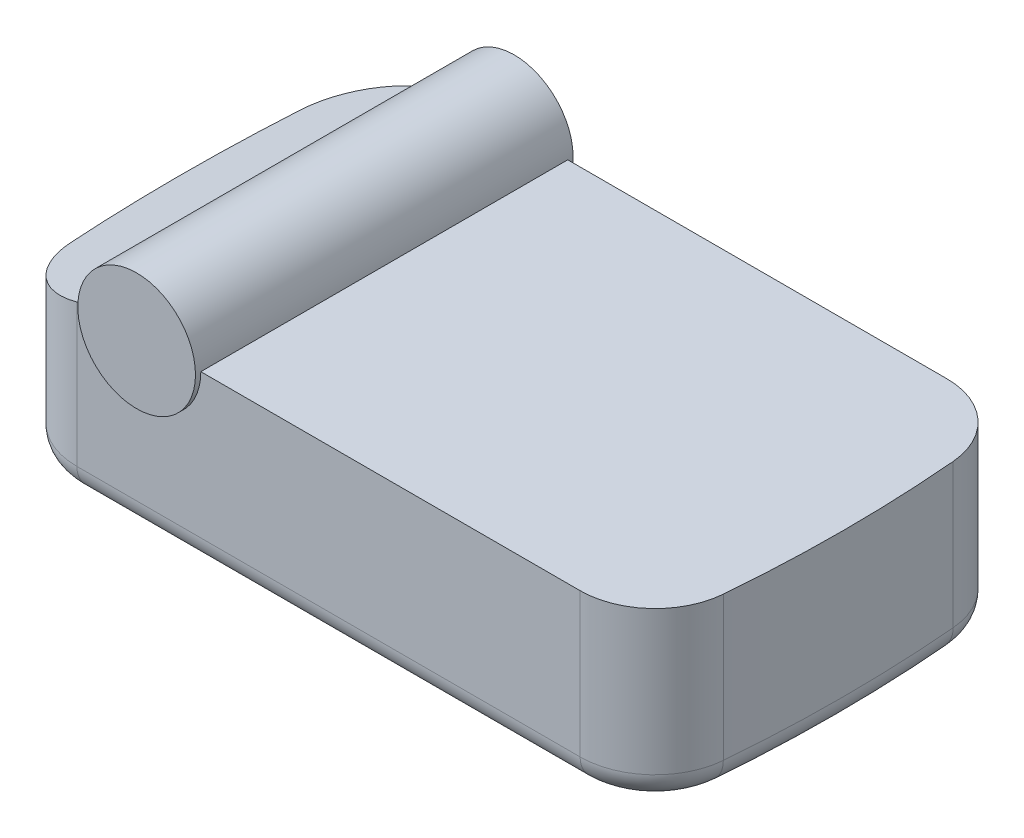
ISO-10303-21;
HEADER;
FILE_DESCRIPTION(('STEP AP214'),'2;1');
FILE_NAME('part.step','',(''),(''),'','','');
FILE_SCHEMA(('AUTOMOTIVE_DESIGN { 1 0 10303 214 1 1 1 1 }'));
ENDSEC;
DATA;
#1=APPLICATION_CONTEXT('core data for automotive mechanical design processes');
#2=APPLICATION_PROTOCOL_DEFINITION('international standard','automotive_design',2000,#1);
#3=PRODUCT_CONTEXT('',#1,'mechanical');
#4=PRODUCT('Part','Part','',(#3));
#5=PRODUCT_RELATED_PRODUCT_CATEGORY('part','',(#4));
#6=PRODUCT_DEFINITION_FORMATION('','',#4);
#7=PRODUCT_DEFINITION_CONTEXT('part definition',#1,'design');
#8=PRODUCT_DEFINITION('design','',#6,#7);
#9=PRODUCT_DEFINITION_SHAPE('','',#8);
#10=(LENGTH_UNIT() NAMED_UNIT(*) SI_UNIT(.MILLI.,.METRE.));
#11=(NAMED_UNIT(*) PLANE_ANGLE_UNIT() SI_UNIT($,.RADIAN.));
#12=(NAMED_UNIT(*) SI_UNIT($,.STERADIAN.) SOLID_ANGLE_UNIT());
#13=UNCERTAINTY_MEASURE_WITH_UNIT(LENGTH_MEASURE(1.E-05),#10,'distance_accuracy_value','');
#14=(GEOMETRIC_REPRESENTATION_CONTEXT(3) GLOBAL_UNCERTAINTY_ASSIGNED_CONTEXT((#13)) GLOBAL_UNIT_ASSIGNED_CONTEXT((#10,
#11,#12)) REPRESENTATION_CONTEXT('',''));
#15=CARTESIAN_POINT('',(0.,0.,0.));
#16=DIRECTION('',(0.,0.,1.));
#17=DIRECTION('',(1.,0.,0.));
#18=AXIS2_PLACEMENT_3D('',#15,#16,#17);
#19=CARTESIAN_POINT('',(23.5199690557792,16.,-10.15));
#20=DIRECTION('',(0.,-1.,0.));
#21=DIRECTION('',(0.,0.,-1.));
#22=AXIS2_PLACEMENT_3D('',#19,#20,#21);
#23=PLANE('',#22);
#24=DIRECTION('',(-1.,0.,0.));
#25=VECTOR('',#24,1.);
#26=CARTESIAN_POINT('',(-23.5199690557792,16.,-17.15));
#27=LINE('',#26,#25);
#28=CARTESIAN_POINT('',(23.5199690557792,16.,-17.15));
#29=VERTEX_POINT('',#28);
#30=CARTESIAN_POINT('',(-11.9389939517277,16.,-17.15));
#31=VERTEX_POINT('',#30);
#32=EDGE_CURVE('E301',#29,#31,#27,.T.);
#33=ORIENTED_EDGE('',*,*,#32,.T.);
#34=DIRECTION('',(0.,0.,1.));
#35=VECTOR('',#34,1.);
#36=CARTESIAN_POINT('',(-11.9389939517277,16.,-33.706349186104));
#37=LINE('',#36,#35);
#38=CARTESIAN_POINT('',(-11.9389939517277,16.,17.15));
#39=VERTEX_POINT('',#38);
#40=EDGE_CURVE('E13',#31,#39,#37,.T.);
#41=ORIENTED_EDGE('',*,*,#40,.T.);
#42=DIRECTION('',(1.,0.,0.));
#43=VECTOR('',#42,1.);
#44=CARTESIAN_POINT('',(-23.5199690557792,16.,17.15));
#45=LINE('',#44,#43);
#46=CARTESIAN_POINT('',(23.5199690557792,16.,17.15));
#47=VERTEX_POINT('',#46);
#48=EDGE_CURVE('E304',#39,#47,#45,.T.);
#49=ORIENTED_EDGE('',*,*,#48,.T.);
#50=CARTESIAN_POINT('',(23.5199690557792,16.,10.15));
#51=DIRECTION('',(0.,1.,0.));
#52=DIRECTION('',(0.,0.,1.));
#53=AXIS2_PLACEMENT_3D('',#50,#51,#52);
#54=CIRCLE('',#53,6.99999999999999);
#55=CARTESIAN_POINT('',(30.4948839173664,16.,10.7420833333333));
#56=VERTEX_POINT('',#55);
#57=EDGE_CURVE('E307',#47,#56,#54,.T.);
#58=ORIENTED_EDGE('',*,*,#57,.T.);
#59=CARTESIAN_POINT('',(-96.05,16.,0.));
#60=DIRECTION('',(0.,1.,0.));
#61=DIRECTION('',(0.,0.,-1.));
#62=AXIS2_PLACEMENT_3D('',#59,#60,#61);
#63=CIRCLE('',#62,127.);
#64=CARTESIAN_POINT('',(30.4948839173663,16.,-10.7420833333333));
#65=VERTEX_POINT('',#64);
#66=EDGE_CURVE('E310',#56,#65,#63,.T.);
#67=ORIENTED_EDGE('',*,*,#66,.T.);
#68=CARTESIAN_POINT('',(23.5199690557792,16.,-10.15));
#69=DIRECTION('',(0.,1.,0.));
#70=DIRECTION('',(0.,0.,-1.));
#71=AXIS2_PLACEMENT_3D('',#68,#69,#70);
#72=CIRCLE('',#71,6.99999999999999);
#73=EDGE_CURVE('E273',#65,#29,#72,.T.);
#74=ORIENTED_EDGE('',*,*,#73,.T.);
#75=EDGE_LOOP('',(#33,#41,#49,#58,#67,#74));
#76=FACE_BOUND('',#75,.T.);
#77=ADVANCED_FACE('F51',(#76),#23,.F.);
#78=CARTESIAN_POINT('',(23.5199690557792,16.,-10.15));
#79=DIRECTION('',(0.,-1.,0.));
#80=DIRECTION('',(0.,0.,-1.));
#81=AXIS2_PLACEMENT_3D('',#78,#79,#80);
#82=CYLINDRICAL_SURFACE('',#81,6.99999999999999);
#83=DIRECTION('',(0.,-1.,0.));
#84=VECTOR('',#83,1.);
#85=CARTESIAN_POINT('',(30.4948839173663,16.,-10.7420833333333));
#86=LINE('',#85,#84);
#87=CARTESIAN_POINT('',(30.4948839173663,2.54,-10.7420833333333));
#88=VERTEX_POINT('',#87);
#89=EDGE_CURVE('E313',#65,#88,#86,.T.);
#90=ORIENTED_EDGE('',*,*,#89,.T.);
#91=CARTESIAN_POINT('',(23.5199690557792,2.54,-10.15));
#92=DIRECTION('',(0.,-1.,0.));
#93=DIRECTION('',(0.,0.,-1.));
#94=AXIS2_PLACEMENT_3D('',#91,#92,#93);
#95=CIRCLE('',#94,6.99999999999999);
#96=CARTESIAN_POINT('',(23.5199690557792,2.54,-17.15));
#97=VERTEX_POINT('',#96);
#98=EDGE_CURVE('E225',#88,#97,#95,.F.);
#99=ORIENTED_EDGE('',*,*,#98,.T.);
#100=DIRECTION('',(0.,-1.,0.));
#101=VECTOR('',#100,1.);
#102=CARTESIAN_POINT('',(23.5199690557792,16.,-17.15));
#103=LINE('',#102,#101);
#104=EDGE_CURVE('E188',#29,#97,#103,.T.);
#105=ORIENTED_EDGE('',*,*,#104,.F.);
#106=ORIENTED_EDGE('',*,*,#73,.F.);
#107=EDGE_LOOP('',(#90,#99,#105,#106));
#108=FACE_BOUND('',#107,.T.);
#109=ADVANCED_FACE('F343',(#108),#82,.T.);
#110=CARTESIAN_POINT('',(-23.5199690557792,16.,-17.15));
#111=DIRECTION('',(0.,0.,1.));
#112=DIRECTION('',(1.,0.,0.));
#113=AXIS2_PLACEMENT_3D('',#110,#111,#112);
#114=PLANE('',#113);
#115=DIRECTION('',(0.,-1.,0.));
#116=VECTOR('',#115,1.);
#117=CARTESIAN_POINT('',(-23.5199690557792,16.,-17.15));
#118=LINE('',#117,#116);
#119=CARTESIAN_POINT('',(-23.5199690557792,15.8443281900468,-17.15));
#120=VERTEX_POINT('',#119);
#121=CARTESIAN_POINT('',(-23.5199690557792,2.54,-17.15));
#122=VERTEX_POINT('',#121);
#123=EDGE_CURVE('E185',#120,#122,#118,.T.);
#124=ORIENTED_EDGE('',*,*,#123,.F.);
#125=DIRECTION('',(0.96592582628907,0.258819045102515,0.));
#126=VECTOR('',#125,1.);
#127=CARTESIAN_POINT('',(-23.4810511032909,15.8547562239871,-17.15));
#128=LINE('',#127,#126);
#129=CARTESIAN_POINT('',(-22.9389939517277,16.,-17.15));
#130=VERTEX_POINT('',#129);
#131=EDGE_CURVE('E276',#120,#130,#128,.T.);
#132=ORIENTED_EDGE('',*,*,#131,.T.);
#133=CARTESIAN_POINT('',(-17.4389939517277,16.,-17.15));
#134=DIRECTION('',(0.,0.,1.));
#135=DIRECTION('',(1.,0.,0.));
#136=AXIS2_PLACEMENT_3D('',#133,#134,#135);
#137=CIRCLE('',#136,5.5);
#138=EDGE_CURVE('E247',#130,#31,#137,.T.);
#139=ORIENTED_EDGE('',*,*,#138,.T.);
#140=ORIENTED_EDGE('',*,*,#32,.F.);
#141=ORIENTED_EDGE('',*,*,#104,.T.);
#142=DIRECTION('',(-1.,0.,0.));
#143=VECTOR('',#142,1.);
#144=CARTESIAN_POINT('',(-23.5199690557792,2.54,-17.15));
#145=LINE('',#144,#143);
#146=EDGE_CURVE('E221',#97,#122,#145,.T.);
#147=ORIENTED_EDGE('',*,*,#146,.T.);
#148=EDGE_LOOP('',(#124,#132,#139,#140,#141,#147));
#149=FACE_BOUND('',#148,.T.);
#150=ADVANCED_FACE('F283',(#149),#114,.F.);
#151=CARTESIAN_POINT('',(-23.5199690557792,16.,-10.15));
#152=DIRECTION('',(0.,-1.,0.));
#153=DIRECTION('',(0.,0.,-1.));
#154=AXIS2_PLACEMENT_3D('',#151,#152,#153);
#155=CYLINDRICAL_SURFACE('',#154,6.99999999999999);
#156=DIRECTION('',(0.,-1.,0.));
#157=VECTOR('',#156,1.);
#158=CARTESIAN_POINT('',(-30.4948839173663,16.,-10.7420833333333));
#159=LINE('',#158,#157);
#160=CARTESIAN_POINT('',(-30.4948839173663,13.9754053856088,-10.7420833333333));
#161=VERTEX_POINT('',#160);
#162=CARTESIAN_POINT('',(-30.4948839173663,2.54,-10.7420833333333));
#163=VERTEX_POINT('',#162);
#164=EDGE_CURVE('E176',#161,#163,#159,.T.);
#165=ORIENTED_EDGE('',*,*,#164,.F.);
#166=CARTESIAN_POINT('',(-23.5199690557792,15.8443281900468,-10.15));
#167=DIRECTION('',(0.258819045102515,-0.96592582628907,0.));
#168=DIRECTION('',(-0.96592582628907,-0.258819045102515,0.));
#169=AXIS2_PLACEMENT_3D('',#166,#167,#168);
#170=ELLIPSE('',#169,7.24693326287056,6.99999999999999);
#171=EDGE_CURVE('E287',#161,#120,#170,.T.);
#172=ORIENTED_EDGE('',*,*,#171,.T.);
#173=ORIENTED_EDGE('',*,*,#123,.T.);
#174=CARTESIAN_POINT('',(-23.5199690557792,2.54,-10.15));
#175=DIRECTION('',(0.,-1.,0.));
#176=DIRECTION('',(0.,0.,-1.));
#177=AXIS2_PLACEMENT_3D('',#174,#175,#176);
#178=CIRCLE('',#177,6.99999999999999);
#179=EDGE_CURVE('E192',#122,#163,#178,.F.);
#180=ORIENTED_EDGE('',*,*,#179,.T.);
#181=EDGE_LOOP('',(#165,#172,#173,#180));
#182=FACE_BOUND('',#181,.T.);
#183=ADVANCED_FACE('F371',(#182),#155,.T.);
#184=CARTESIAN_POINT('',(96.05,16.,0.));
#185=DIRECTION('',(0.,-1.,0.));
#186=DIRECTION('',(0.,0.,-1.));
#187=AXIS2_PLACEMENT_3D('',#184,#185,#186);
#188=CYLINDRICAL_SURFACE('',#187,127.);
#189=CARTESIAN_POINT('',(96.05,47.8830048375564,0.));
#190=DIRECTION('',(0.258819045102515,-0.96592582628907,0.));
#191=DIRECTION('',(-0.96592582628907,-0.258819045102515,0.));
#192=AXIS2_PLACEMENT_3D('',#189,#190,#191);
#193=ELLIPSE('',#192,131.48007491208,127.);
#194=CARTESIAN_POINT('',(-30.4948839173663,13.9754053856088,10.7420833333333));
#195=VERTEX_POINT('',#194);
#196=EDGE_CURVE('E158',#195,#161,#193,.T.);
#197=ORIENTED_EDGE('',*,*,#196,.T.);
#198=ORIENTED_EDGE('',*,*,#164,.T.);
#199=CARTESIAN_POINT('',(96.05,2.54,0.));
#200=DIRECTION('',(0.,-1.,0.));
#201=DIRECTION('',(0.,0.,-1.));
#202=AXIS2_PLACEMENT_3D('',#199,#200,#201);
#203=CIRCLE('',#202,127.);
#204=CARTESIAN_POINT('',(-30.4948839173663,2.54,10.7420833333333));
#205=VERTEX_POINT('',#204);
#206=EDGE_CURVE('E239',#163,#205,#203,.F.);
#207=ORIENTED_EDGE('',*,*,#206,.T.);
#208=DIRECTION('',(0.,-1.,0.));
#209=VECTOR('',#208,1.);
#210=CARTESIAN_POINT('',(-30.4948839173663,16.,10.7420833333333));
#211=LINE('',#210,#209);
#212=EDGE_CURVE('E67',#195,#205,#211,.T.);
#213=ORIENTED_EDGE('',*,*,#212,.F.);
#214=EDGE_LOOP('',(#197,#198,#207,#213));
#215=FACE_BOUND('',#214,.T.);
#216=ADVANCED_FACE('F413',(#215),#188,.T.);
#217=CARTESIAN_POINT('',(-23.5199690557792,16.,10.15));
#218=DIRECTION('',(0.,-1.,0.));
#219=DIRECTION('',(0.,0.,-1.));
#220=AXIS2_PLACEMENT_3D('',#217,#218,#219);
#221=CYLINDRICAL_SURFACE('',#220,7.);
#222=DIRECTION('',(0.,-1.,0.));
#223=VECTOR('',#222,1.);
#224=CARTESIAN_POINT('',(-23.5199690557792,16.,17.15));
#225=LINE('',#224,#223);
#226=CARTESIAN_POINT('',(-23.5199690557792,15.8443281900468,17.15));
#227=VERTEX_POINT('',#226);
#228=CARTESIAN_POINT('',(-23.5199690557792,2.54,17.15));
#229=VERTEX_POINT('',#228);
#230=EDGE_CURVE('E75',#227,#229,#225,.T.);
#231=ORIENTED_EDGE('',*,*,#230,.F.);
#232=CARTESIAN_POINT('',(-23.5199690557792,15.8443281900468,10.15));
#233=DIRECTION('',(0.258819045102515,-0.96592582628907,0.));
#234=DIRECTION('',(-0.96592582628907,-0.258819045102515,0.));
#235=AXIS2_PLACEMENT_3D('',#232,#233,#234);
#236=ELLIPSE('',#235,7.24693326287057,7.);
#237=EDGE_CURVE('E153',#227,#195,#236,.T.);
#238=ORIENTED_EDGE('',*,*,#237,.T.);
#239=ORIENTED_EDGE('',*,*,#212,.T.);
#240=CARTESIAN_POINT('',(-23.5199690557792,2.54,10.15));
#241=DIRECTION('',(0.,-1.,0.));
#242=DIRECTION('',(0.,0.,-1.));
#243=AXIS2_PLACEMENT_3D('',#240,#241,#242);
#244=CIRCLE('',#243,7.);
#245=EDGE_CURVE('E169',#205,#229,#244,.F.);
#246=ORIENTED_EDGE('',*,*,#245,.T.);
#247=EDGE_LOOP('',(#231,#238,#239,#246));
#248=FACE_BOUND('',#247,.T.);
#249=ADVANCED_FACE('F167',(#248),#221,.T.);
#250=CARTESIAN_POINT('',(-23.5199690557792,16.,17.15));
#251=DIRECTION('',(0.,0.,-1.));
#252=DIRECTION('',(-1.,0.,0.));
#253=AXIS2_PLACEMENT_3D('',#250,#251,#252);
#254=PLANE('',#253);
#255=CARTESIAN_POINT('',(-17.4389939517277,16.,17.15));
#256=DIRECTION('',(0.,0.,-1.));
#257=DIRECTION('',(-1.,0.,0.));
#258=AXIS2_PLACEMENT_3D('',#255,#256,#257);
#259=CIRCLE('',#258,5.5);
#260=CARTESIAN_POINT('',(-22.9389939517277,16.,17.15));
#261=VERTEX_POINT('',#260);
#262=EDGE_CURVE('E164',#39,#261,#259,.T.);
#263=ORIENTED_EDGE('',*,*,#262,.T.);
#264=DIRECTION('',(0.96592582628907,0.258819045102515,0.));
#265=VECTOR('',#264,1.);
#266=CARTESIAN_POINT('',(-22.9389939517277,16.,17.15));
#267=LINE('',#266,#265);
#268=EDGE_CURVE('E156',#227,#261,#267,.T.);
#269=ORIENTED_EDGE('',*,*,#268,.F.);
#270=ORIENTED_EDGE('',*,*,#230,.T.);
#271=DIRECTION('',(1.,0.,0.));
#272=VECTOR('',#271,1.);
#273=CARTESIAN_POINT('',(23.5199690557792,2.54,17.15));
#274=LINE('',#273,#272);
#275=CARTESIAN_POINT('',(23.5199690557792,2.54,17.15));
#276=VERTEX_POINT('',#275);
#277=EDGE_CURVE('E231',#229,#276,#274,.T.);
#278=ORIENTED_EDGE('',*,*,#277,.T.);
#279=DIRECTION('',(0.,-1.,0.));
#280=VECTOR('',#279,1.);
#281=CARTESIAN_POINT('',(23.5199690557792,16.,17.15));
#282=LINE('',#281,#280);
#283=EDGE_CURVE('E172',#47,#276,#282,.T.);
#284=ORIENTED_EDGE('',*,*,#283,.F.);
#285=ORIENTED_EDGE('',*,*,#48,.F.);
#286=EDGE_LOOP('',(#263,#269,#270,#278,#284,#285));
#287=FACE_BOUND('',#286,.T.);
#288=ADVANCED_FACE('F162',(#287),#254,.F.);
#289=CARTESIAN_POINT('',(23.5199690557792,16.,10.15));
#290=DIRECTION('',(0.,-1.,0.));
#291=DIRECTION('',(0.,0.,-1.));
#292=AXIS2_PLACEMENT_3D('',#289,#290,#291);
#293=CYLINDRICAL_SURFACE('',#292,6.99999999999999);
#294=ORIENTED_EDGE('',*,*,#283,.T.);
#295=CARTESIAN_POINT('',(23.5199690557792,2.54,10.15));
#296=DIRECTION('',(0.,-1.,0.));
#297=DIRECTION('',(0.,0.,-1.));
#298=AXIS2_PLACEMENT_3D('',#295,#296,#297);
#299=CIRCLE('',#298,6.99999999999999);
#300=CARTESIAN_POINT('',(30.4948839173664,2.54,10.7420833333333));
#301=VERTEX_POINT('',#300);
#302=EDGE_CURVE('E228',#276,#301,#299,.F.);
#303=ORIENTED_EDGE('',*,*,#302,.T.);
#304=DIRECTION('',(0.,-1.,0.));
#305=VECTOR('',#304,1.);
#306=CARTESIAN_POINT('',(30.4948839173664,16.,10.7420833333333));
#307=LINE('',#306,#305);
#308=EDGE_CURVE('E179',#56,#301,#307,.T.);
#309=ORIENTED_EDGE('',*,*,#308,.F.);
#310=ORIENTED_EDGE('',*,*,#57,.F.);
#311=EDGE_LOOP('',(#294,#303,#309,#310));
#312=FACE_BOUND('',#311,.T.);
#313=ADVANCED_FACE('F348',(#312),#293,.T.);
#314=CARTESIAN_POINT('',(-96.05,16.,0.));
#315=DIRECTION('',(0.,-1.,0.));
#316=DIRECTION('',(0.,0.,-1.));
#317=AXIS2_PLACEMENT_3D('',#314,#315,#316);
#318=CYLINDRICAL_SURFACE('',#317,127.);
#319=ORIENTED_EDGE('',*,*,#308,.T.);
#320=CARTESIAN_POINT('',(-96.05,2.54,0.));
#321=DIRECTION('',(0.,-1.,0.));
#322=DIRECTION('',(0.,0.,-1.));
#323=AXIS2_PLACEMENT_3D('',#320,#321,#322);
#324=CIRCLE('',#323,127.);
#325=EDGE_CURVE('E236',#301,#88,#324,.F.);
#326=ORIENTED_EDGE('',*,*,#325,.T.);
#327=ORIENTED_EDGE('',*,*,#89,.F.);
#328=ORIENTED_EDGE('',*,*,#66,.F.);
#329=EDGE_LOOP('',(#319,#326,#327,#328));
#330=FACE_BOUND('',#329,.T.);
#331=ADVANCED_FACE('F322',(#330),#318,.T.);
#332=CARTESIAN_POINT('',(23.5199690557792,0.,-10.15));
#333=DIRECTION('',(0.,-1.,0.));
#334=DIRECTION('',(0.,0.,-1.));
#335=AXIS2_PLACEMENT_3D('',#332,#333,#334);
#336=PLANE('',#335);
#337=CARTESIAN_POINT('',(-23.5199690557792,0.,-10.15));
#338=DIRECTION('',(0.,-1.,0.));
#339=DIRECTION('',(0.,0.,-1.));
#340=AXIS2_PLACEMENT_3D('',#337,#338,#339);
#341=CIRCLE('',#340,4.45999999999999);
#342=CARTESIAN_POINT('',(-27.963986239019,0.,-10.5272416666667));
#343=VERTEX_POINT('',#342);
#344=CARTESIAN_POINT('',(-23.5199690557792,0.,-14.61));
#345=VERTEX_POINT('',#344);
#346=EDGE_CURVE('E208',#343,#345,#341,.T.);
#347=ORIENTED_EDGE('',*,*,#346,.T.);
#348=DIRECTION('',(-1.,0.,0.));
#349=VECTOR('',#348,1.);
#350=CARTESIAN_POINT('',(23.5199690557792,0.,-14.61));
#351=LINE('',#350,#349);
#352=CARTESIAN_POINT('',(23.5199690557792,0.,-14.61));
#353=VERTEX_POINT('',#352);
#354=EDGE_CURVE('E218',#345,#353,#351,.F.);
#355=ORIENTED_EDGE('',*,*,#354,.T.);
#356=CARTESIAN_POINT('',(23.5199690557792,0.,-10.15));
#357=DIRECTION('',(0.,-1.,0.));
#358=DIRECTION('',(0.,0.,-1.));
#359=AXIS2_PLACEMENT_3D('',#356,#357,#358);
#360=CIRCLE('',#359,4.45999999999999);
#361=CARTESIAN_POINT('',(27.963986239019,0.,-10.5272416666667));
#362=VERTEX_POINT('',#361);
#363=EDGE_CURVE('E215',#353,#362,#360,.T.);
#364=ORIENTED_EDGE('',*,*,#363,.T.);
#365=CARTESIAN_POINT('',(-96.05,0.,0.));
#366=DIRECTION('',(0.,-1.,0.));
#367=DIRECTION('',(0.,0.,-1.));
#368=AXIS2_PLACEMENT_3D('',#365,#366,#367);
#369=CIRCLE('',#368,124.46);
#370=CARTESIAN_POINT('',(27.963986239019,0.,10.5272416666667));
#371=VERTEX_POINT('',#370);
#372=EDGE_CURVE('E212',#362,#371,#369,.T.);
#373=ORIENTED_EDGE('',*,*,#372,.T.);
#374=CARTESIAN_POINT('',(23.5199690557792,0.,10.15));
#375=DIRECTION('',(0.,-1.,0.));
#376=DIRECTION('',(0.,0.,-1.));
#377=AXIS2_PLACEMENT_3D('',#374,#375,#376);
#378=CIRCLE('',#377,4.45999999999999);
#379=CARTESIAN_POINT('',(23.5199690557792,0.,14.61));
#380=VERTEX_POINT('',#379);
#381=EDGE_CURVE('E205',#371,#380,#378,.T.);
#382=ORIENTED_EDGE('',*,*,#381,.T.);
#383=DIRECTION('',(1.,0.,0.));
#384=VECTOR('',#383,1.);
#385=CARTESIAN_POINT('',(-23.5199690557792,0.,14.61));
#386=LINE('',#385,#384);
#387=CARTESIAN_POINT('',(-23.5199690557792,0.,14.61));
#388=VERTEX_POINT('',#387);
#389=EDGE_CURVE('E202',#380,#388,#386,.F.);
#390=ORIENTED_EDGE('',*,*,#389,.T.);
#391=CARTESIAN_POINT('',(-23.5199690557792,0.,10.15));
#392=DIRECTION('',(0.,-1.,0.));
#393=DIRECTION('',(0.,0.,-1.));
#394=AXIS2_PLACEMENT_3D('',#391,#392,#393);
#395=CIRCLE('',#394,4.46);
#396=CARTESIAN_POINT('',(-27.963986239019,0.,10.5272416666666));
#397=VERTEX_POINT('',#396);
#398=EDGE_CURVE('E199',#388,#397,#395,.T.);
#399=ORIENTED_EDGE('',*,*,#398,.T.);
#400=CARTESIAN_POINT('',(96.05,0.,0.));
#401=DIRECTION('',(0.,-1.,0.));
#402=DIRECTION('',(0.,0.,-1.));
#403=AXIS2_PLACEMENT_3D('',#400,#401,#402);
#404=CIRCLE('',#403,124.46);
#405=EDGE_CURVE('E196',#397,#343,#404,.T.);
#406=ORIENTED_EDGE('',*,*,#405,.T.);
#407=EDGE_LOOP('',(#347,#355,#364,#373,#382,#390,#399,#406));
#408=FACE_BOUND('',#407,.T.);
#409=ADVANCED_FACE('F359',(#408),#336,.T.);
#410=CARTESIAN_POINT('',(23.5199690557792,2.54,10.15));
#411=DIRECTION('',(0.,-1.,0.));
#412=DIRECTION('',(0.,0.,-1.));
#413=AXIS2_PLACEMENT_3D('',#410,#411,#412);
#414=TOROIDAL_SURFACE('',#413,4.45999999999999,2.54);
#415=CARTESIAN_POINT('',(23.5199690557792,2.54,14.61));
#416=DIRECTION('',(-1.,0.,0.));
#417=DIRECTION('',(0.,0.,1.));
#418=AXIS2_PLACEMENT_3D('',#415,#416,#417);
#419=CIRCLE('',#418,2.54);
#420=EDGE_CURVE('E266',#380,#276,#419,.T.);
#421=ORIENTED_EDGE('',*,*,#420,.F.);
#422=ORIENTED_EDGE('',*,*,#381,.F.);
#423=CARTESIAN_POINT('',(27.963986239019,2.54,10.5272416666667));
#424=DIRECTION('',(0.0845833333333326,0.,-0.99641640879816));
#425=DIRECTION('',(-0.99641640879816,0.,-0.0845833333333327));
#426=AXIS2_PLACEMENT_3D('',#423,#424,#425);
#427=CIRCLE('',#426,2.54);
#428=EDGE_CURVE('E270',#301,#371,#427,.T.);
#429=ORIENTED_EDGE('',*,*,#428,.F.);
#430=ORIENTED_EDGE('',*,*,#302,.F.);
#431=EDGE_LOOP('',(#421,#422,#429,#430));
#432=FACE_BOUND('',#431,.T.);
#433=ADVANCED_FACE('F53',(#432),#414,.T.);
#434=CARTESIAN_POINT('',(-96.05,2.54,0.));
#435=DIRECTION('',(0.,-1.,0.));
#436=DIRECTION('',(0.,0.,-1.));
#437=AXIS2_PLACEMENT_3D('',#434,#435,#436);
#438=TOROIDAL_SURFACE('',#437,124.46,2.54);
#439=ORIENTED_EDGE('',*,*,#428,.T.);
#440=ORIENTED_EDGE('',*,*,#372,.F.);
#441=CARTESIAN_POINT('',(27.963986239019,2.54,-10.5272416666667));
#442=DIRECTION('',(-0.0845833333333333,0.,-0.99641640879816));
#443=DIRECTION('',(-0.99641640879816,0.,0.0845833333333333));
#444=AXIS2_PLACEMENT_3D('',#441,#442,#443);
#445=CIRCLE('',#444,2.54);
#446=EDGE_CURVE('E262',#88,#362,#445,.T.);
#447=ORIENTED_EDGE('',*,*,#446,.F.);
#448=ORIENTED_EDGE('',*,*,#325,.F.);
#449=EDGE_LOOP('',(#439,#440,#447,#448));
#450=FACE_BOUND('',#449,.T.);
#451=ADVANCED_FACE('F334',(#450),#438,.T.);
#452=CARTESIAN_POINT('',(-23.5199690557792,2.54,14.61));
#453=DIRECTION('',(-1.,0.,0.));
#454=DIRECTION('',(0.,0.,1.));
#455=AXIS2_PLACEMENT_3D('',#452,#453,#454);
#456=CYLINDRICAL_SURFACE('',#455,2.54);
#457=ORIENTED_EDGE('',*,*,#420,.T.);
#458=ORIENTED_EDGE('',*,*,#277,.F.);
#459=CARTESIAN_POINT('',(-23.5199690557792,2.54,14.61));
#460=DIRECTION('',(-1.,0.,0.));
#461=DIRECTION('',(0.,0.,1.));
#462=AXIS2_PLACEMENT_3D('',#459,#460,#461);
#463=CIRCLE('',#462,2.54);
#464=EDGE_CURVE('E258',#388,#229,#463,.T.);
#465=ORIENTED_EDGE('',*,*,#464,.F.);
#466=ORIENTED_EDGE('',*,*,#389,.F.);
#467=EDGE_LOOP('',(#457,#458,#465,#466));
#468=FACE_BOUND('',#467,.T.);
#469=ADVANCED_FACE('F351',(#468),#456,.T.);
#470=CARTESIAN_POINT('',(23.5199690557792,2.54,-10.15));
#471=DIRECTION('',(0.,-1.,0.));
#472=DIRECTION('',(0.,0.,-1.));
#473=AXIS2_PLACEMENT_3D('',#470,#471,#472);
#474=TOROIDAL_SURFACE('',#473,4.45999999999999,2.54);
#475=ORIENTED_EDGE('',*,*,#446,.T.);
#476=ORIENTED_EDGE('',*,*,#363,.F.);
#477=CARTESIAN_POINT('',(23.5199690557792,2.54,-14.61));
#478=DIRECTION('',(-1.,0.,0.));
#479=DIRECTION('',(0.,0.,1.));
#480=AXIS2_PLACEMENT_3D('',#477,#478,#479);
#481=CIRCLE('',#480,2.54);
#482=EDGE_CURVE('E254',#97,#353,#481,.T.);
#483=ORIENTED_EDGE('',*,*,#482,.F.);
#484=ORIENTED_EDGE('',*,*,#98,.F.);
#485=EDGE_LOOP('',(#475,#476,#483,#484));
#486=FACE_BOUND('',#485,.T.);
#487=ADVANCED_FACE('F339',(#486),#474,.T.);
#488=CARTESIAN_POINT('',(-23.5199690557792,2.54,10.15));
#489=DIRECTION('',(0.,-1.,0.));
#490=DIRECTION('',(0.,0.,-1.));
#491=AXIS2_PLACEMENT_3D('',#488,#489,#490);
#492=TOROIDAL_SURFACE('',#491,4.46,2.54);
#493=ORIENTED_EDGE('',*,*,#464,.T.);
#494=ORIENTED_EDGE('',*,*,#245,.F.);
#495=CARTESIAN_POINT('',(-27.963986239019,2.54,10.5272416666666));
#496=DIRECTION('',(-0.0845833333333244,0.,-0.996416408798161));
#497=DIRECTION('',(-0.996416408798161,0.,0.0845833333333244));
#498=AXIS2_PLACEMENT_3D('',#495,#496,#497);
#499=CIRCLE('',#498,2.54);
#500=EDGE_CURVE('E250',#397,#205,#499,.T.);
#501=ORIENTED_EDGE('',*,*,#500,.F.);
#502=ORIENTED_EDGE('',*,*,#398,.F.);
#503=EDGE_LOOP('',(#493,#494,#501,#502));
#504=FACE_BOUND('',#503,.T.);
#505=ADVANCED_FACE('F355',(#504),#492,.T.);
#506=CARTESIAN_POINT('',(-23.5199690557792,2.54,-14.61));
#507=DIRECTION('',(1.,0.,0.));
#508=DIRECTION('',(0.,0.,-1.));
#509=AXIS2_PLACEMENT_3D('',#506,#507,#508);
#510=CYLINDRICAL_SURFACE('',#509,2.54);
#511=ORIENTED_EDGE('',*,*,#482,.T.);
#512=ORIENTED_EDGE('',*,*,#354,.F.);
#513=CARTESIAN_POINT('',(-23.5199690557792,2.54,-14.61));
#514=DIRECTION('',(-1.,0.,0.));
#515=DIRECTION('',(0.,0.,1.));
#516=AXIS2_PLACEMENT_3D('',#513,#514,#515);
#517=CIRCLE('',#516,2.54);
#518=EDGE_CURVE('E246',#122,#345,#517,.T.);
#519=ORIENTED_EDGE('',*,*,#518,.F.);
#520=ORIENTED_EDGE('',*,*,#146,.F.);
#521=EDGE_LOOP('',(#511,#512,#519,#520));
#522=FACE_BOUND('',#521,.T.);
#523=ADVANCED_FACE('F363',(#522),#510,.T.);
#524=CARTESIAN_POINT('',(96.05,2.54,0.));
#525=DIRECTION('',(0.,-1.,0.));
#526=DIRECTION('',(0.,0.,-1.));
#527=AXIS2_PLACEMENT_3D('',#524,#525,#526);
#528=TOROIDAL_SURFACE('',#527,124.46,2.54);
#529=ORIENTED_EDGE('',*,*,#500,.T.);
#530=ORIENTED_EDGE('',*,*,#206,.F.);
#531=CARTESIAN_POINT('',(-27.963986239019,2.54,-10.5272416666667));
#532=DIRECTION('',(0.0845833333333333,0.,-0.99641640879816));
#533=DIRECTION('',(-0.99641640879816,0.,-0.0845833333333333));
#534=AXIS2_PLACEMENT_3D('',#531,#532,#533);
#535=CIRCLE('',#534,2.54);
#536=EDGE_CURVE('E242',#343,#163,#535,.T.);
#537=ORIENTED_EDGE('',*,*,#536,.F.);
#538=ORIENTED_EDGE('',*,*,#405,.F.);
#539=EDGE_LOOP('',(#529,#530,#537,#538));
#540=FACE_BOUND('',#539,.T.);
#541=ADVANCED_FACE('F394',(#540),#528,.T.);
#542=CARTESIAN_POINT('',(-23.5199690557792,2.54,-10.15));
#543=DIRECTION('',(0.,-1.,0.));
#544=DIRECTION('',(0.,0.,-1.));
#545=AXIS2_PLACEMENT_3D('',#542,#543,#544);
#546=TOROIDAL_SURFACE('',#545,4.45999999999999,2.54);
#547=ORIENTED_EDGE('',*,*,#518,.T.);
#548=ORIENTED_EDGE('',*,*,#346,.F.);
#549=ORIENTED_EDGE('',*,*,#536,.T.);
#550=ORIENTED_EDGE('',*,*,#179,.F.);
#551=EDGE_LOOP('',(#547,#548,#549,#550));
#552=FACE_BOUND('',#551,.T.);
#553=ADVANCED_FACE('F366',(#552),#546,.T.);
#554=CARTESIAN_POINT('',(-17.4389939517277,16.,-33.706349186104));
#555=DIRECTION('',(0.,0.,1.));
#556=DIRECTION('',(1.,0.,0.));
#557=AXIS2_PLACEMENT_3D('',#554,#555,#556);
#558=CYLINDRICAL_SURFACE('',#557,5.5);
#559=ORIENTED_EDGE('',*,*,#138,.F.);
#560=DIRECTION('',(0.,0.,1.));
#561=VECTOR('',#560,1.);
#562=CARTESIAN_POINT('',(-22.9389939517277,16.,-33.706349186104));
#563=LINE('',#562,#561);
#564=EDGE_CURVE('E60',#261,#130,#563,.F.);
#565=ORIENTED_EDGE('',*,*,#564,.F.);
#566=ORIENTED_EDGE('',*,*,#262,.F.);
#567=ORIENTED_EDGE('',*,*,#40,.F.);
#568=EDGE_LOOP('',(#559,#565,#566,#567));
#569=FACE_BOUND('',#568,.T.);
#570=CARTESIAN_POINT('',(-17.4389939517277,16.,17.65));
#571=DIRECTION('',(0.,0.,1.));
#572=DIRECTION('',(1.,0.,0.));
#573=AXIS2_PLACEMENT_3D('',#570,#571,#572);
#574=CIRCLE('',#573,5.5);
#575=CARTESIAN_POINT('',(-11.9389939517277,16.,17.65));
#576=VERTEX_POINT('',#575);
#577=EDGE_CURVE('E286',#576,#576,#574,.T.);
#578=ORIENTED_EDGE('',*,*,#577,.F.);
#579=EDGE_LOOP('',(#578));
#580=FACE_BOUND('',#579,.T.);
#581=CARTESIAN_POINT('',(-17.4389939517277,16.,-17.65));
#582=DIRECTION('',(0.,0.,1.));
#583=DIRECTION('',(1.,0.,0.));
#584=AXIS2_PLACEMENT_3D('',#581,#582,#583);
#585=CIRCLE('',#584,5.5);
#586=CARTESIAN_POINT('',(-11.9389939517277,16.,-17.65));
#587=VERTEX_POINT('',#586);
#588=EDGE_CURVE('E294',#587,#587,#585,.F.);
#589=ORIENTED_EDGE('',*,*,#588,.F.);
#590=EDGE_LOOP('',(#589));
#591=FACE_BOUND('',#590,.T.);
#592=ADVANCED_FACE('F289',(#569,#580,#591),#558,.T.);
#593=CARTESIAN_POINT('',(-23.5199690557792,16.,-17.65));
#594=DIRECTION('',(0.,0.,1.));
#595=DIRECTION('',(1.,0.,0.));
#596=AXIS2_PLACEMENT_3D('',#593,#594,#595);
#597=PLANE('',#596);
#598=ORIENTED_EDGE('',*,*,#588,.T.);
#599=EDGE_LOOP('',(#598));
#600=FACE_BOUND('',#599,.T.);
#601=ADVANCED_FACE('F383',(#600),#597,.F.);
#602=CARTESIAN_POINT('',(-17.4389939517277,16.,17.65));
#603=DIRECTION('',(0.,0.,1.));
#604=DIRECTION('',(1.,0.,0.));
#605=AXIS2_PLACEMENT_3D('',#602,#603,#604);
#606=PLANE('',#605);
#607=ORIENTED_EDGE('',*,*,#577,.T.);
#608=EDGE_LOOP('',(#607));
#609=FACE_BOUND('',#608,.T.);
#610=ADVANCED_FACE('F391',(#609),#606,.T.);
#611=CARTESIAN_POINT('',(-22.9389939517277,16.,-17.65));
#612=DIRECTION('',(0.258819045102515,-0.96592582628907,0.));
#613=DIRECTION('',(0.96592582628907,0.258819045102515,0.));
#614=AXIS2_PLACEMENT_3D('',#611,#612,#613);
#615=PLANE('',#614);
#616=ORIENTED_EDGE('',*,*,#171,.F.);
#617=ORIENTED_EDGE('',*,*,#196,.F.);
#618=ORIENTED_EDGE('',*,*,#237,.F.);
#619=ORIENTED_EDGE('',*,*,#268,.T.);
#620=ORIENTED_EDGE('',*,*,#564,.T.);
#621=ORIENTED_EDGE('',*,*,#131,.F.);
#622=EDGE_LOOP('',(#616,#617,#618,#619,#620,#621));
#623=FACE_BOUND('',#622,.T.);
#624=ADVANCED_FACE('F155',(#623),#615,.F.);
#625=CLOSED_SHELL('',(#77,#109,#150,#183,#216,#249,#288,#313,#331,#409,#433,#451,#469,#487,#505,
#523,#541,#553,#592,#601,#610,#624));
#626=MANIFOLD_SOLID_BREP('B2',#625);
#627=ADVANCED_BREP_SHAPE_REPRESENTATION('',(#18,#626),#14);
#628=SHAPE_DEFINITION_REPRESENTATION(#9,#627);
ENDSEC;
END-ISO-10303-21;
